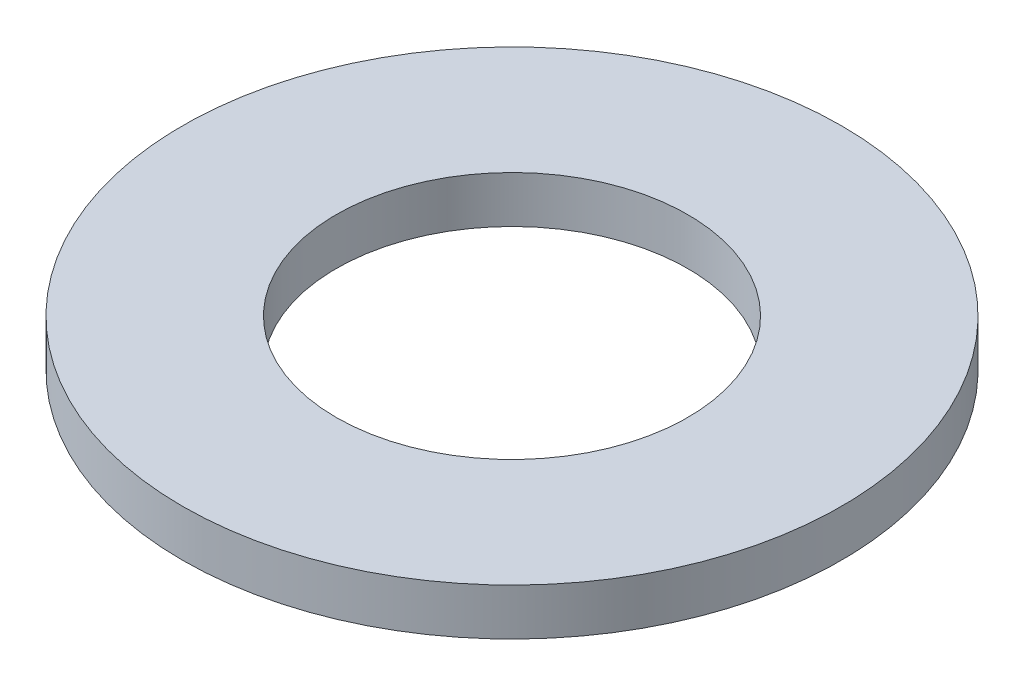
ISO-10303-21;
HEADER;
FILE_DESCRIPTION(('STEP AP214'),'2;1');
FILE_NAME('part.step','',(''),(''),'','','');
FILE_SCHEMA(('AUTOMOTIVE_DESIGN { 1 0 10303 214 1 1 1 1 }'));
ENDSEC;
DATA;
#1=APPLICATION_CONTEXT('core data for automotive mechanical design processes');
#2=APPLICATION_PROTOCOL_DEFINITION('international standard','automotive_design',2000,#1);
#3=PRODUCT_CONTEXT('',#1,'mechanical');
#4=PRODUCT('Part','Part','',(#3));
#5=PRODUCT_RELATED_PRODUCT_CATEGORY('part','',(#4));
#6=PRODUCT_DEFINITION_FORMATION('','',#4);
#7=PRODUCT_DEFINITION_CONTEXT('part definition',#1,'design');
#8=PRODUCT_DEFINITION('design','',#6,#7);
#9=PRODUCT_DEFINITION_SHAPE('','',#8);
#10=(LENGTH_UNIT() NAMED_UNIT(*) SI_UNIT(.MILLI.,.METRE.));
#11=(NAMED_UNIT(*) PLANE_ANGLE_UNIT() SI_UNIT($,.RADIAN.));
#12=(NAMED_UNIT(*) SI_UNIT($,.STERADIAN.) SOLID_ANGLE_UNIT());
#13=UNCERTAINTY_MEASURE_WITH_UNIT(LENGTH_MEASURE(1.E-05),#10,'distance_accuracy_value','');
#14=(GEOMETRIC_REPRESENTATION_CONTEXT(3) GLOBAL_UNCERTAINTY_ASSIGNED_CONTEXT((#13)) GLOBAL_UNIT_ASSIGNED_CONTEXT((#10,
#11,#12)) REPRESENTATION_CONTEXT('',''));
#15=CARTESIAN_POINT('',(0.,0.,0.));
#16=DIRECTION('',(0.,0.,1.));
#17=DIRECTION('',(1.,0.,0.));
#18=AXIS2_PLACEMENT_3D('',#15,#16,#17);
#19=CARTESIAN_POINT('',(0.,5.32,0.));
#20=DIRECTION('',(0.,1.,0.));
#21=DIRECTION('',(0.,0.,1.));
#22=AXIS2_PLACEMENT_3D('',#19,#20,#21);
#23=PLANE('',#22);
#24=CARTESIAN_POINT('',(0.,5.32,0.));
#25=DIRECTION('',(0.,1.,0.));
#26=DIRECTION('',(0.,0.,1.));
#27=AXIS2_PLACEMENT_3D('',#24,#25,#26);
#28=CIRCLE('',#27,37.5);
#29=CARTESIAN_POINT('',(0.,5.32,37.5));
#30=VERTEX_POINT('',#29);
#31=EDGE_CURVE('E10',#30,#30,#28,.T.);
#32=ORIENTED_EDGE('',*,*,#31,.T.);
#33=EDGE_LOOP('',(#32));
#34=FACE_BOUND('',#33,.T.);
#35=CARTESIAN_POINT('',(0.,5.32,0.));
#36=DIRECTION('',(0.,1.,0.));
#37=DIRECTION('',(0.,0.,1.));
#38=AXIS2_PLACEMENT_3D('',#35,#36,#37);
#39=CIRCLE('',#38,20.);
#40=CARTESIAN_POINT('',(0.,5.32,20.));
#41=VERTEX_POINT('',#40);
#42=EDGE_CURVE('E48',#41,#41,#39,.T.);
#43=ORIENTED_EDGE('',*,*,#42,.F.);
#44=EDGE_LOOP('',(#43));
#45=FACE_BOUND('',#44,.T.);
#46=ADVANCED_FACE('F37',(#34,#45),#23,.T.);
#47=CARTESIAN_POINT('',(0.,0.,0.));
#48=DIRECTION('',(0.,1.,0.));
#49=DIRECTION('',(0.,0.,1.));
#50=AXIS2_PLACEMENT_3D('',#47,#48,#49);
#51=PLANE('',#50);
#52=CARTESIAN_POINT('',(0.,0.,0.));
#53=DIRECTION('',(0.,1.,0.));
#54=DIRECTION('',(0.,0.,1.));
#55=AXIS2_PLACEMENT_3D('',#52,#53,#54);
#56=CIRCLE('',#55,37.5);
#57=CARTESIAN_POINT('',(0.,0.,37.5));
#58=VERTEX_POINT('',#57);
#59=EDGE_CURVE('E41',#58,#58,#56,.T.);
#60=ORIENTED_EDGE('',*,*,#59,.F.);
#61=EDGE_LOOP('',(#60));
#62=FACE_BOUND('',#61,.T.);
#63=CARTESIAN_POINT('',(0.,0.,0.));
#64=DIRECTION('',(0.,1.,0.));
#65=DIRECTION('',(0.,0.,1.));
#66=AXIS2_PLACEMENT_3D('',#63,#64,#65);
#67=CIRCLE('',#66,20.);
#68=CARTESIAN_POINT('',(0.,0.,20.));
#69=VERTEX_POINT('',#68);
#70=EDGE_CURVE('E50',#69,#69,#67,.T.);
#71=ORIENTED_EDGE('',*,*,#70,.T.);
#72=EDGE_LOOP('',(#71));
#73=FACE_BOUND('',#72,.T.);
#74=ADVANCED_FACE('F60',(#62,#73),#51,.F.);
#75=CARTESIAN_POINT('',(0.,5.32,0.));
#76=DIRECTION('',(0.,-1.,0.));
#77=DIRECTION('',(0.,0.,-1.));
#78=AXIS2_PLACEMENT_3D('',#75,#76,#77);
#79=CYLINDRICAL_SURFACE('',#78,37.5);
#80=ORIENTED_EDGE('',*,*,#31,.F.);
#81=EDGE_LOOP('',(#80));
#82=FACE_BOUND('',#81,.T.);
#83=ORIENTED_EDGE('',*,*,#59,.T.);
#84=EDGE_LOOP('',(#83));
#85=FACE_BOUND('',#84,.T.);
#86=ADVANCED_FACE('F39',(#82,#85),#79,.T.);
#87=CARTESIAN_POINT('',(0.,5.32,0.));
#88=DIRECTION('',(0.,-1.,0.));
#89=DIRECTION('',(0.,0.,-1.));
#90=AXIS2_PLACEMENT_3D('',#87,#88,#89);
#91=CYLINDRICAL_SURFACE('',#90,20.);
#92=ORIENTED_EDGE('',*,*,#42,.T.);
#93=EDGE_LOOP('',(#92));
#94=FACE_BOUND('',#93,.T.);
#95=ORIENTED_EDGE('',*,*,#70,.F.);
#96=EDGE_LOOP('',(#95));
#97=FACE_BOUND('',#96,.T.);
#98=ADVANCED_FACE('F56',(#94,#97),#91,.F.);
#99=CLOSED_SHELL('',(#46,#74,#86,#98));
#100=MANIFOLD_SOLID_BREP('B2',#99);
#101=ADVANCED_BREP_SHAPE_REPRESENTATION('',(#18,#100),#14);
#102=SHAPE_DEFINITION_REPRESENTATION(#9,#101);
ENDSEC;
END-ISO-10303-21;
